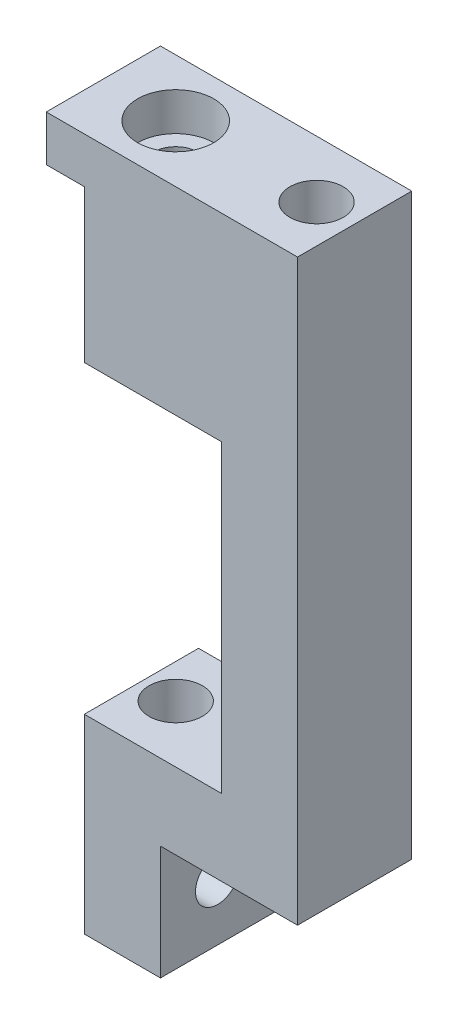
ISO-10303-21;
HEADER;
FILE_DESCRIPTION(('STEP AP214'),'2;1');
FILE_NAME('part.step','',(''),(''),'','','');
FILE_SCHEMA(('AUTOMOTIVE_DESIGN { 1 0 10303 214 1 1 1 1 }'));
ENDSEC;
DATA;
#1=APPLICATION_CONTEXT('core data for automotive mechanical design processes');
#2=APPLICATION_PROTOCOL_DEFINITION('international standard','automotive_design',2000,#1);
#3=PRODUCT_CONTEXT('',#1,'mechanical');
#4=PRODUCT('Part','Part','',(#3));
#5=PRODUCT_RELATED_PRODUCT_CATEGORY('part','',(#4));
#6=PRODUCT_DEFINITION_FORMATION('','',#4);
#7=PRODUCT_DEFINITION_CONTEXT('part definition',#1,'design');
#8=PRODUCT_DEFINITION('design','',#6,#7);
#9=PRODUCT_DEFINITION_SHAPE('','',#8);
#10=(LENGTH_UNIT() NAMED_UNIT(*) SI_UNIT(.MILLI.,.METRE.));
#11=(NAMED_UNIT(*) PLANE_ANGLE_UNIT() SI_UNIT($,.RADIAN.));
#12=(NAMED_UNIT(*) SI_UNIT($,.STERADIAN.) SOLID_ANGLE_UNIT());
#13=UNCERTAINTY_MEASURE_WITH_UNIT(LENGTH_MEASURE(1.E-05),#10,'distance_accuracy_value','');
#14=(GEOMETRIC_REPRESENTATION_CONTEXT(3) GLOBAL_UNCERTAINTY_ASSIGNED_CONTEXT((#13)) GLOBAL_UNIT_ASSIGNED_CONTEXT((#10,
#11,#12)) REPRESENTATION_CONTEXT('',''));
#15=CARTESIAN_POINT('',(0.,0.,0.));
#16=DIRECTION('',(0.,0.,1.));
#17=DIRECTION('',(1.,0.,0.));
#18=AXIS2_PLACEMENT_3D('',#15,#16,#17);
#19=CARTESIAN_POINT('',(10.,0.,0.));
#20=DIRECTION('',(-1.,0.,0.));
#21=DIRECTION('',(0.,0.,1.));
#22=AXIS2_PLACEMENT_3D('',#19,#20,#21);
#23=PLANE('',#22);
#24=DIRECTION('',(0.,-1.,0.));
#25=VECTOR('',#24,1.);
#26=CARTESIAN_POINT('',(10.,-70.,-7.5));
#27=LINE('',#26,#25);
#28=CARTESIAN_POINT('',(10.,-70.,-7.5));
#29=VERTEX_POINT('',#28);
#30=CARTESIAN_POINT('',(10.,-85.,-7.5));
#31=VERTEX_POINT('',#30);
#32=EDGE_CURVE('E70',#29,#31,#27,.T.);
#33=ORIENTED_EDGE('',*,*,#32,.F.);
#34=DIRECTION('',(0.,0.,-1.));
#35=VECTOR('',#34,1.);
#36=CARTESIAN_POINT('',(10.,-70.,-7.5));
#37=LINE('',#36,#35);
#38=CARTESIAN_POINT('',(10.,-70.,7.5));
#39=VERTEX_POINT('',#38);
#40=EDGE_CURVE('E222',#39,#29,#37,.T.);
#41=ORIENTED_EDGE('',*,*,#40,.F.);
#42=DIRECTION('',(0.,1.,0.));
#43=VECTOR('',#42,1.);
#44=CARTESIAN_POINT('',(10.,-70.,7.5));
#45=LINE('',#44,#43);
#46=CARTESIAN_POINT('',(10.,-85.,7.5));
#47=VERTEX_POINT('',#46);
#48=EDGE_CURVE('E221',#47,#39,#45,.T.);
#49=ORIENTED_EDGE('',*,*,#48,.F.);
#50=DIRECTION('',(0.,0.,1.));
#51=VECTOR('',#50,1.);
#52=CARTESIAN_POINT('',(10.,-85.,-7.5));
#53=LINE('',#52,#51);
#54=EDGE_CURVE('E220',#31,#47,#53,.T.);
#55=ORIENTED_EDGE('',*,*,#54,.F.);
#56=EDGE_LOOP('',(#33,#41,#49,#55));
#57=FACE_BOUND('',#56,.T.);
#58=CARTESIAN_POINT('',(10.,-77.5,0.));
#59=DIRECTION('',(1.,0.,0.));
#60=DIRECTION('',(0.,0.,-1.));
#61=AXIS2_PLACEMENT_3D('',#58,#59,#60);
#62=CIRCLE('',#61,2.89999999999999);
#63=CARTESIAN_POINT('',(10.,-77.5,-2.89999999999999));
#64=VERTEX_POINT('',#63);
#65=EDGE_CURVE('E207',#64,#64,#62,.T.);
#66=ORIENTED_EDGE('',*,*,#65,.F.);
#67=EDGE_LOOP('',(#66));
#68=FACE_BOUND('',#67,.T.);
#69=ADVANCED_FACE('F46',(#57,#68),#23,.F.);
#70=CARTESIAN_POINT('',(0.,-100.,7.5));
#71=DIRECTION('',(1.,0.,0.));
#72=DIRECTION('',(0.,0.,-1.));
#73=AXIS2_PLACEMENT_3D('',#70,#71,#72);
#74=PLANE('',#73);
#75=DIRECTION('',(0.,-1.,0.));
#76=VECTOR('',#75,1.);
#77=CARTESIAN_POINT('',(0.,-100.,-7.5));
#78=LINE('',#77,#76);
#79=CARTESIAN_POINT('',(0.,0.,-7.5));
#80=VERTEX_POINT('',#79);
#81=CARTESIAN_POINT('',(0.,-20.,-7.5));
#82=VERTEX_POINT('',#81);
#83=EDGE_CURVE('E301',#80,#82,#78,.T.);
#84=ORIENTED_EDGE('',*,*,#83,.T.);
#85=DIRECTION('',(0.,0.,1.));
#86=VECTOR('',#85,1.);
#87=CARTESIAN_POINT('',(0.,-20.,-7.501));
#88=LINE('',#87,#86);
#89=CARTESIAN_POINT('',(0.,-20.,7.5));
#90=VERTEX_POINT('',#89);
#91=EDGE_CURVE('E278',#82,#90,#88,.T.);
#92=ORIENTED_EDGE('',*,*,#91,.T.);
#93=DIRECTION('',(0.,-1.,0.));
#94=VECTOR('',#93,1.);
#95=CARTESIAN_POINT('',(0.,-100.,7.5));
#96=LINE('',#95,#94);
#97=CARTESIAN_POINT('',(0.,0.,7.5));
#98=VERTEX_POINT('',#97);
#99=EDGE_CURVE('E57',#98,#90,#96,.T.);
#100=ORIENTED_EDGE('',*,*,#99,.F.);
#101=DIRECTION('',(0.,0.,-1.));
#102=VECTOR('',#101,1.);
#103=CARTESIAN_POINT('',(0.,0.,7.5));
#104=LINE('',#103,#102);
#105=EDGE_CURVE('E12',#98,#80,#104,.T.);
#106=ORIENTED_EDGE('',*,*,#105,.T.);
#107=EDGE_LOOP('',(#84,#92,#100,#106));
#108=FACE_BOUND('',#107,.T.);
#109=ADVANCED_FACE('F327',(#108),#74,.F.);
#110=CARTESIAN_POINT('',(0.,-77.5,0.));
#111=DIRECTION('',(1.,0.,0.));
#112=DIRECTION('',(0.,0.,-1.));
#113=AXIS2_PLACEMENT_3D('',#110,#111,#112);
#114=CIRCLE('',#113,2.89999999999999);
#115=CARTESIAN_POINT('',(0.,-77.5,-2.89999999999999));
#116=VERTEX_POINT('',#115);
#117=EDGE_CURVE('E208',#116,#116,#114,.T.);
#118=ORIENTED_EDGE('',*,*,#117,.T.);
#119=EDGE_LOOP('',(#118));
#120=FACE_BOUND('',#119,.T.);
#121=CARTESIAN_POINT('',(0.,-60.,-7.5));
#122=VERTEX_POINT('',#121);
#123=CARTESIAN_POINT('',(0.,-85.,-7.5));
#124=VERTEX_POINT('',#123);
#125=EDGE_CURVE('E298',#122,#124,#78,.T.);
#126=ORIENTED_EDGE('',*,*,#125,.T.);
#127=DIRECTION('',(0.,0.,1.));
#128=VECTOR('',#127,1.);
#129=CARTESIAN_POINT('',(0.,-85.,-7.5));
#130=LINE('',#129,#128);
#131=CARTESIAN_POINT('',(0.,-85.,7.5));
#132=VERTEX_POINT('',#131);
#133=EDGE_CURVE('E211',#124,#132,#130,.T.);
#134=ORIENTED_EDGE('',*,*,#133,.T.);
#135=CARTESIAN_POINT('',(0.,-60.,7.5));
#136=VERTEX_POINT('',#135);
#137=EDGE_CURVE('E297',#136,#132,#96,.T.);
#138=ORIENTED_EDGE('',*,*,#137,.F.);
#139=DIRECTION('',(0.,0.,1.));
#140=VECTOR('',#139,1.);
#141=CARTESIAN_POINT('',(0.,-60.,-7.501));
#142=LINE('',#141,#140);
#143=EDGE_CURVE('E276',#122,#136,#142,.T.);
#144=ORIENTED_EDGE('',*,*,#143,.F.);
#145=EDGE_LOOP('',(#126,#134,#138,#144));
#146=FACE_BOUND('',#145,.T.);
#147=ADVANCED_FACE('F334',(#120,#146),#74,.F.);
#148=CARTESIAN_POINT('',(0.,0.,7.5));
#149=DIRECTION('',(0.,0.,-1.));
#150=DIRECTION('',(-1.,0.,0.));
#151=AXIS2_PLACEMENT_3D('',#148,#149,#150);
#152=PLANE('',#151);
#153=DIRECTION('',(-1.,0.,0.));
#154=VECTOR('',#153,1.);
#155=CARTESIAN_POINT('',(0.,-70.,7.5));
#156=LINE('',#155,#154);
#157=CARTESIAN_POINT('',(28.,-70.,7.5));
#158=VERTEX_POINT('',#157);
#159=EDGE_CURVE('E252',#158,#39,#156,.T.);
#160=ORIENTED_EDGE('',*,*,#159,.F.);
#161=DIRECTION('',(0.,-1.,0.));
#162=VECTOR('',#161,1.);
#163=CARTESIAN_POINT('',(28.,0.,7.5));
#164=LINE('',#163,#162);
#165=CARTESIAN_POINT('',(28.,6.,7.5));
#166=VERTEX_POINT('',#165);
#167=EDGE_CURVE('E76',#166,#158,#164,.T.);
#168=ORIENTED_EDGE('',*,*,#167,.F.);
#169=DIRECTION('',(1.,0.,0.));
#170=VECTOR('',#169,1.);
#171=CARTESIAN_POINT('',(-5.,6.,7.50000000000001));
#172=LINE('',#171,#170);
#173=CARTESIAN_POINT('',(-5.,6.,7.50000000000001));
#174=VERTEX_POINT('',#173);
#175=EDGE_CURVE('E161',#174,#166,#172,.T.);
#176=ORIENTED_EDGE('',*,*,#175,.F.);
#177=DIRECTION('',(0.,-1.,0.));
#178=VECTOR('',#177,1.);
#179=CARTESIAN_POINT('',(-5.,6.,7.50000000000001));
#180=LINE('',#179,#178);
#181=CARTESIAN_POINT('',(-5.,0.,7.50000000000001));
#182=VERTEX_POINT('',#181);
#183=EDGE_CURVE('E169',#174,#182,#180,.T.);
#184=ORIENTED_EDGE('',*,*,#183,.T.);
#185=DIRECTION('',(1.,0.,0.));
#186=VECTOR('',#185,1.);
#187=CARTESIAN_POINT('',(-5.,0.,7.50000000000001));
#188=LINE('',#187,#186);
#189=EDGE_CURVE('E381',#182,#98,#188,.T.);
#190=ORIENTED_EDGE('',*,*,#189,.T.);
#191=ORIENTED_EDGE('',*,*,#99,.T.);
#192=DIRECTION('',(-1.,0.,0.));
#193=VECTOR('',#192,1.);
#194=CARTESIAN_POINT('',(0.,-20.,7.5));
#195=LINE('',#194,#193);
#196=CARTESIAN_POINT('',(18.,-20.,7.5));
#197=VERTEX_POINT('',#196);
#198=EDGE_CURVE('E277',#197,#90,#195,.T.);
#199=ORIENTED_EDGE('',*,*,#198,.F.);
#200=DIRECTION('',(0.,1.,0.));
#201=VECTOR('',#200,1.);
#202=CARTESIAN_POINT('',(18.,-20.,7.5));
#203=LINE('',#202,#201);
#204=CARTESIAN_POINT('',(18.,-60.,7.5));
#205=VERTEX_POINT('',#204);
#206=EDGE_CURVE('E275',#205,#197,#203,.T.);
#207=ORIENTED_EDGE('',*,*,#206,.F.);
#208=DIRECTION('',(1.,0.,0.));
#209=VECTOR('',#208,1.);
#210=CARTESIAN_POINT('',(0.,-60.,7.5));
#211=LINE('',#210,#209);
#212=EDGE_CURVE('E268',#136,#205,#211,.T.);
#213=ORIENTED_EDGE('',*,*,#212,.F.);
#214=ORIENTED_EDGE('',*,*,#137,.T.);
#215=DIRECTION('',(-1.,0.,0.));
#216=VECTOR('',#215,1.);
#217=CARTESIAN_POINT('',(10.,-85.,7.5));
#218=LINE('',#217,#216);
#219=EDGE_CURVE('E233',#47,#132,#218,.T.);
#220=ORIENTED_EDGE('',*,*,#219,.F.);
#221=ORIENTED_EDGE('',*,*,#48,.T.);
#222=EDGE_LOOP('',(#160,#168,#176,#184,#190,#191,#199,#207,#213,#214,#220,#221));
#223=FACE_BOUND('',#222,.T.);
#224=ADVANCED_FACE('F168',(#223),#152,.F.);
#225=CARTESIAN_POINT('',(0.,0.,-7.5));
#226=DIRECTION('',(0.,0.,-1.));
#227=DIRECTION('',(-1.,0.,0.));
#228=AXIS2_PLACEMENT_3D('',#225,#226,#227);
#229=PLANE('',#228);
#230=DIRECTION('',(0.,-1.,0.));
#231=VECTOR('',#230,1.);
#232=CARTESIAN_POINT('',(28.,0.,-7.5));
#233=LINE('',#232,#231);
#234=CARTESIAN_POINT('',(28.,6.,-7.5));
#235=VERTEX_POINT('',#234);
#236=CARTESIAN_POINT('',(28.,-70.,-7.5));
#237=VERTEX_POINT('',#236);
#238=EDGE_CURVE('E243',#235,#237,#233,.T.);
#239=ORIENTED_EDGE('',*,*,#238,.T.);
#240=DIRECTION('',(-1.,0.,0.));
#241=VECTOR('',#240,1.);
#242=CARTESIAN_POINT('',(0.,-70.,-7.5));
#243=LINE('',#242,#241);
#244=EDGE_CURVE('E250',#237,#29,#243,.T.);
#245=ORIENTED_EDGE('',*,*,#244,.T.);
#246=ORIENTED_EDGE('',*,*,#32,.T.);
#247=DIRECTION('',(-1.,0.,0.));
#248=VECTOR('',#247,1.);
#249=CARTESIAN_POINT('',(10.,-85.,-7.5));
#250=LINE('',#249,#248);
#251=EDGE_CURVE('E227',#31,#124,#250,.T.);
#252=ORIENTED_EDGE('',*,*,#251,.T.);
#253=ORIENTED_EDGE('',*,*,#125,.F.);
#254=DIRECTION('',(1.,0.,0.));
#255=VECTOR('',#254,1.);
#256=CARTESIAN_POINT('',(0.,-60.,-7.5));
#257=LINE('',#256,#255);
#258=CARTESIAN_POINT('',(18.,-60.,-7.5));
#259=VERTEX_POINT('',#258);
#260=EDGE_CURVE('E282',#122,#259,#257,.T.);
#261=ORIENTED_EDGE('',*,*,#260,.T.);
#262=DIRECTION('',(0.,1.,0.));
#263=VECTOR('',#262,1.);
#264=CARTESIAN_POINT('',(18.,-20.,-7.5));
#265=LINE('',#264,#263);
#266=CARTESIAN_POINT('',(18.,-20.,-7.5));
#267=VERTEX_POINT('',#266);
#268=EDGE_CURVE('E258',#259,#267,#265,.T.);
#269=ORIENTED_EDGE('',*,*,#268,.T.);
#270=DIRECTION('',(-1.,0.,0.));
#271=VECTOR('',#270,1.);
#272=CARTESIAN_POINT('',(0.,-20.,-7.5));
#273=LINE('',#272,#271);
#274=EDGE_CURVE('E262',#267,#82,#273,.T.);
#275=ORIENTED_EDGE('',*,*,#274,.T.);
#276=ORIENTED_EDGE('',*,*,#83,.F.);
#277=DIRECTION('',(-1.,0.,0.));
#278=VECTOR('',#277,1.);
#279=CARTESIAN_POINT('',(28.,0.,-7.5));
#280=LINE('',#279,#278);
#281=CARTESIAN_POINT('',(-5.,0.,-7.5));
#282=VERTEX_POINT('',#281);
#283=EDGE_CURVE('E187',#80,#282,#280,.T.);
#284=ORIENTED_EDGE('',*,*,#283,.T.);
#285=DIRECTION('',(0.,-1.,0.));
#286=VECTOR('',#285,1.);
#287=CARTESIAN_POINT('',(-5.,6.,-7.5));
#288=LINE('',#287,#286);
#289=CARTESIAN_POINT('',(-5.,6.,-7.5));
#290=VERTEX_POINT('',#289);
#291=EDGE_CURVE('E194',#290,#282,#288,.T.);
#292=ORIENTED_EDGE('',*,*,#291,.F.);
#293=DIRECTION('',(-1.,0.,0.));
#294=VECTOR('',#293,1.);
#295=CARTESIAN_POINT('',(28.,6.,-7.5));
#296=LINE('',#295,#294);
#297=EDGE_CURVE('E181',#235,#290,#296,.T.);
#298=ORIENTED_EDGE('',*,*,#297,.F.);
#299=EDGE_LOOP('',(#239,#245,#246,#252,#253,#261,#269,#275,#276,#284,#292,#298));
#300=FACE_BOUND('',#299,.T.);
#301=ADVANCED_FACE('F358',(#300),#229,.T.);
#302=CARTESIAN_POINT('',(0.,-20.,-7.501));
#303=DIRECTION('',(0.,1.,0.));
#304=DIRECTION('',(0.,0.,1.));
#305=AXIS2_PLACEMENT_3D('',#302,#303,#304);
#306=PLANE('',#305);
#307=CARTESIAN_POINT('',(4.5,-20.,0.));
#308=DIRECTION('',(0.,1.,0.));
#309=DIRECTION('',(0.,0.,1.));
#310=AXIS2_PLACEMENT_3D('',#307,#308,#309);
#311=CIRCLE('',#310,2.89999999999998);
#312=CARTESIAN_POINT('',(4.5,-20.,2.89999999999998));
#313=VERTEX_POINT('',#312);
#314=EDGE_CURVE('E257',#313,#313,#311,.T.);
#315=ORIENTED_EDGE('',*,*,#314,.T.);
#316=EDGE_LOOP('',(#315));
#317=FACE_BOUND('',#316,.T.);
#318=DIRECTION('',(0.,0.,1.));
#319=VECTOR('',#318,1.);
#320=CARTESIAN_POINT('',(18.,-20.,-7.501));
#321=LINE('',#320,#319);
#322=EDGE_CURVE('E284',#267,#197,#321,.T.);
#323=ORIENTED_EDGE('',*,*,#322,.T.);
#324=ORIENTED_EDGE('',*,*,#198,.T.);
#325=ORIENTED_EDGE('',*,*,#91,.F.);
#326=ORIENTED_EDGE('',*,*,#274,.F.);
#327=EDGE_LOOP('',(#323,#324,#325,#326));
#328=FACE_BOUND('',#327,.T.);
#329=ADVANCED_FACE('F353',(#317,#328),#306,.F.);
#330=CARTESIAN_POINT('',(18.,-20.,-7.501));
#331=DIRECTION('',(1.,0.,0.));
#332=DIRECTION('',(0.,1.,0.));
#333=AXIS2_PLACEMENT_3D('',#330,#331,#332);
#334=PLANE('',#333);
#335=DIRECTION('',(0.,0.,1.));
#336=VECTOR('',#335,1.);
#337=CARTESIAN_POINT('',(18.,-60.,-7.501));
#338=LINE('',#337,#336);
#339=EDGE_CURVE('E288',#259,#205,#338,.T.);
#340=ORIENTED_EDGE('',*,*,#339,.T.);
#341=ORIENTED_EDGE('',*,*,#206,.T.);
#342=ORIENTED_EDGE('',*,*,#322,.F.);
#343=ORIENTED_EDGE('',*,*,#268,.F.);
#344=EDGE_LOOP('',(#340,#341,#342,#343));
#345=FACE_BOUND('',#344,.T.);
#346=ADVANCED_FACE('F328',(#345),#334,.F.);
#347=CARTESIAN_POINT('',(0.,-60.,-7.501));
#348=DIRECTION('',(0.,-1.,0.));
#349=DIRECTION('',(1.,0.,0.));
#350=AXIS2_PLACEMENT_3D('',#347,#348,#349);
#351=PLANE('',#350);
#352=CARTESIAN_POINT('',(4.5,-60.,0.));
#353=DIRECTION('',(0.,-1.,0.));
#354=DIRECTION('',(1.,0.,0.));
#355=AXIS2_PLACEMENT_3D('',#352,#353,#354);
#356=CIRCLE('',#355,3.49999999999998);
#357=CARTESIAN_POINT('',(7.99999999999998,-60.,0.));
#358=VERTEX_POINT('',#357);
#359=EDGE_CURVE('E49',#358,#358,#356,.T.);
#360=ORIENTED_EDGE('',*,*,#359,.T.);
#361=EDGE_LOOP('',(#360));
#362=FACE_BOUND('',#361,.T.);
#363=ORIENTED_EDGE('',*,*,#143,.T.);
#364=ORIENTED_EDGE('',*,*,#212,.T.);
#365=ORIENTED_EDGE('',*,*,#339,.F.);
#366=ORIENTED_EDGE('',*,*,#260,.F.);
#367=EDGE_LOOP('',(#363,#364,#365,#366));
#368=FACE_BOUND('',#367,.T.);
#369=ADVANCED_FACE('F315',(#362,#368),#351,.F.);
#370=CARTESIAN_POINT('',(4.5,0.,0.));
#371=DIRECTION('',(0.,1.,0.));
#372=DIRECTION('',(0.,0.,1.));
#373=AXIS2_PLACEMENT_3D('',#370,#371,#372);
#374=CYLINDRICAL_SURFACE('',#373,3.49999999999998);
#375=CARTESIAN_POINT('',(4.5,-70.,0.));
#376=DIRECTION('',(0.,1.,0.));
#377=DIRECTION('',(0.,0.,1.));
#378=AXIS2_PLACEMENT_3D('',#375,#376,#377);
#379=CIRCLE('',#378,3.49999999999998);
#380=CARTESIAN_POINT('',(4.5,-70.,3.49999999999998));
#381=VERTEX_POINT('',#380);
#382=EDGE_CURVE('E253',#381,#381,#379,.T.);
#383=ORIENTED_EDGE('',*,*,#382,.F.);
#384=EDGE_LOOP('',(#383));
#385=FACE_BOUND('',#384,.T.);
#386=ORIENTED_EDGE('',*,*,#359,.F.);
#387=EDGE_LOOP('',(#386));
#388=FACE_BOUND('',#387,.T.);
#389=ADVANCED_FACE('F48',(#385,#388),#374,.F.);
#390=CARTESIAN_POINT('',(4.5,0.,0.));
#391=DIRECTION('',(0.,1.,0.));
#392=DIRECTION('',(0.,0.,1.));
#393=AXIS2_PLACEMENT_3D('',#390,#391,#392);
#394=CYLINDRICAL_SURFACE('',#393,2.89999999999998);
#395=ORIENTED_EDGE('',*,*,#314,.F.);
#396=EDGE_LOOP('',(#395));
#397=FACE_BOUND('',#396,.T.);
#398=CARTESIAN_POINT('',(4.5,1.,0.));
#399=DIRECTION('',(0.,1.,0.));
#400=DIRECTION('',(0.,0.,1.));
#401=AXIS2_PLACEMENT_3D('',#398,#399,#400);
#402=CIRCLE('',#401,2.89999999999999);
#403=CARTESIAN_POINT('',(4.5,1.,2.89999999999999));
#404=VERTEX_POINT('',#403);
#405=EDGE_CURVE('E196',#404,#404,#402,.T.);
#406=ORIENTED_EDGE('',*,*,#405,.T.);
#407=EDGE_LOOP('',(#406));
#408=FACE_BOUND('',#407,.T.);
#409=ADVANCED_FACE('F317',(#397,#408),#394,.F.);
#410=CARTESIAN_POINT('',(0.,-70.,-7.501));
#411=DIRECTION('',(0.,1.,0.));
#412=DIRECTION('',(0.,0.,1.));
#413=AXIS2_PLACEMENT_3D('',#410,#411,#412);
#414=PLANE('',#413);
#415=ORIENTED_EDGE('',*,*,#159,.T.);
#416=ORIENTED_EDGE('',*,*,#40,.T.);
#417=ORIENTED_EDGE('',*,*,#244,.F.);
#418=DIRECTION('',(0.,0.,1.));
#419=VECTOR('',#418,1.);
#420=CARTESIAN_POINT('',(28.,-70.,-7.501));
#421=LINE('',#420,#419);
#422=EDGE_CURVE('E239',#237,#158,#421,.T.);
#423=ORIENTED_EDGE('',*,*,#422,.T.);
#424=EDGE_LOOP('',(#415,#416,#417,#423));
#425=FACE_BOUND('',#424,.T.);
#426=ADVANCED_FACE('F325',(#425),#414,.F.);
#427=CARTESIAN_POINT('',(28.,0.,-7.501));
#428=DIRECTION('',(-1.,0.,0.));
#429=DIRECTION('',(0.,-1.,0.));
#430=AXIS2_PLACEMENT_3D('',#427,#428,#429);
#431=PLANE('',#430);
#432=ORIENTED_EDGE('',*,*,#238,.F.);
#433=DIRECTION('',(0.,0.,-1.));
#434=VECTOR('',#433,1.);
#435=CARTESIAN_POINT('',(28.,6.,7.5));
#436=LINE('',#435,#434);
#437=EDGE_CURVE('E172',#166,#235,#436,.T.);
#438=ORIENTED_EDGE('',*,*,#437,.F.);
#439=ORIENTED_EDGE('',*,*,#167,.T.);
#440=ORIENTED_EDGE('',*,*,#422,.F.);
#441=EDGE_LOOP('',(#432,#438,#439,#440));
#442=FACE_BOUND('',#441,.T.);
#443=ADVANCED_FACE('F350',(#442),#431,.F.);
#444=CARTESIAN_POINT('',(10.,-85.,-7.5));
#445=DIRECTION('',(0.,-1.,0.));
#446=DIRECTION('',(0.,0.,-1.));
#447=AXIS2_PLACEMENT_3D('',#444,#445,#446);
#448=PLANE('',#447);
#449=ORIENTED_EDGE('',*,*,#133,.F.);
#450=ORIENTED_EDGE('',*,*,#251,.F.);
#451=ORIENTED_EDGE('',*,*,#54,.T.);
#452=ORIENTED_EDGE('',*,*,#219,.T.);
#453=EDGE_LOOP('',(#449,#450,#451,#452));
#454=FACE_BOUND('',#453,.T.);
#455=ADVANCED_FACE('F341',(#454),#448,.T.);
#456=CARTESIAN_POINT('',(10.,-70.,-7.5));
#457=DIRECTION('',(0.,1.,0.));
#458=DIRECTION('',(0.,0.,1.));
#459=AXIS2_PLACEMENT_3D('',#456,#457,#458);
#460=PLANE('',#459);
#461=ORIENTED_EDGE('',*,*,#382,.T.);
#462=EDGE_LOOP('',(#461));
#463=FACE_BOUND('',#462,.T.);
#464=ADVANCED_FACE('F345',(#463),#460,.T.);
#465=CARTESIAN_POINT('',(10.,-77.5,0.));
#466=DIRECTION('',(1.,0.,0.));
#467=DIRECTION('',(0.,0.,-1.));
#468=AXIS2_PLACEMENT_3D('',#465,#466,#467);
#469=CYLINDRICAL_SURFACE('',#468,2.89999999999999);
#470=ORIENTED_EDGE('',*,*,#117,.F.);
#471=EDGE_LOOP('',(#470));
#472=FACE_BOUND('',#471,.T.);
#473=ORIENTED_EDGE('',*,*,#65,.T.);
#474=EDGE_LOOP('',(#473));
#475=FACE_BOUND('',#474,.T.);
#476=ADVANCED_FACE('F338',(#472,#475),#469,.F.);
#477=CARTESIAN_POINT('',(4.5,1.,0.));
#478=DIRECTION('',(0.,1.,0.));
#479=DIRECTION('',(0.,0.,1.));
#480=AXIS2_PLACEMENT_3D('',#477,#478,#479);
#481=PLANE('',#480);
#482=CARTESIAN_POINT('',(4.5,1.,0.));
#483=DIRECTION('',(0.,1.,0.));
#484=DIRECTION('',(0.,0.,1.));
#485=AXIS2_PLACEMENT_3D('',#482,#483,#484);
#486=CIRCLE('',#485,5.);
#487=CARTESIAN_POINT('',(4.5,1.,5.));
#488=VERTEX_POINT('',#487);
#489=EDGE_CURVE('E195',#488,#488,#486,.F.);
#490=ORIENTED_EDGE('',*,*,#489,.F.);
#491=EDGE_LOOP('',(#490));
#492=FACE_BOUND('',#491,.T.);
#493=ORIENTED_EDGE('',*,*,#405,.F.);
#494=EDGE_LOOP('',(#493));
#495=FACE_BOUND('',#494,.T.);
#496=ADVANCED_FACE('F399',(#492,#495),#481,.T.);
#497=CARTESIAN_POINT('',(4.5,0.,0.));
#498=DIRECTION('',(0.,1.,0.));
#499=DIRECTION('',(0.,0.,1.));
#500=AXIS2_PLACEMENT_3D('',#497,#498,#499);
#501=PLANE('',#500);
#502=ORIENTED_EDGE('',*,*,#283,.F.);
#503=ORIENTED_EDGE('',*,*,#105,.F.);
#504=ORIENTED_EDGE('',*,*,#189,.F.);
#505=DIRECTION('',(0.,0.,1.));
#506=VECTOR('',#505,1.);
#507=CARTESIAN_POINT('',(-5.,0.,-7.5));
#508=LINE('',#507,#506);
#509=EDGE_CURVE('E188',#282,#182,#508,.T.);
#510=ORIENTED_EDGE('',*,*,#509,.F.);
#511=EDGE_LOOP('',(#502,#503,#504,#510));
#512=FACE_BOUND('',#511,.T.);
#513=ADVANCED_FACE('F395',(#512),#501,.F.);
#514=CARTESIAN_POINT('',(0.,6.,0.));
#515=DIRECTION('',(0.,1.,0.));
#516=DIRECTION('',(0.,0.,1.));
#517=AXIS2_PLACEMENT_3D('',#514,#515,#516);
#518=PLANE('',#517);
#519=CARTESIAN_POINT('',(23.,6.,0.));
#520=DIRECTION('',(0.,1.,0.));
#521=DIRECTION('',(0.,0.,1.));
#522=AXIS2_PLACEMENT_3D('',#519,#520,#521);
#523=CIRCLE('',#522,3.49999999999999);
#524=CARTESIAN_POINT('',(23.,6.,3.49999999999999));
#525=VERTEX_POINT('',#524);
#526=EDGE_CURVE('E429',#525,#525,#523,.T.);
#527=ORIENTED_EDGE('',*,*,#526,.F.);
#528=EDGE_LOOP('',(#527));
#529=FACE_BOUND('',#528,.T.);
#530=DIRECTION('',(0.,0.,1.));
#531=VECTOR('',#530,1.);
#532=CARTESIAN_POINT('',(-5.,6.,-7.5));
#533=LINE('',#532,#531);
#534=EDGE_CURVE('E174',#290,#174,#533,.T.);
#535=ORIENTED_EDGE('',*,*,#534,.T.);
#536=ORIENTED_EDGE('',*,*,#175,.T.);
#537=ORIENTED_EDGE('',*,*,#437,.T.);
#538=ORIENTED_EDGE('',*,*,#297,.T.);
#539=EDGE_LOOP('',(#535,#536,#537,#538));
#540=FACE_BOUND('',#539,.T.);
#541=CARTESIAN_POINT('',(4.5,6.,0.));
#542=DIRECTION('',(0.,1.,0.));
#543=DIRECTION('',(0.,0.,1.));
#544=AXIS2_PLACEMENT_3D('',#541,#542,#543);
#545=CIRCLE('',#544,5.);
#546=CARTESIAN_POINT('',(4.5,6.,5.));
#547=VERTEX_POINT('',#546);
#548=EDGE_CURVE('E383',#547,#547,#545,.T.);
#549=ORIENTED_EDGE('',*,*,#548,.F.);
#550=EDGE_LOOP('',(#549));
#551=FACE_BOUND('',#550,.T.);
#552=ADVANCED_FACE('F178',(#529,#540,#551),#518,.T.);
#553=CARTESIAN_POINT('',(-5.,6.,-7.5));
#554=DIRECTION('',(1.,0.,0.));
#555=DIRECTION('',(0.,0.,-1.));
#556=AXIS2_PLACEMENT_3D('',#553,#554,#555);
#557=PLANE('',#556);
#558=ORIENTED_EDGE('',*,*,#509,.T.);
#559=ORIENTED_EDGE('',*,*,#183,.F.);
#560=ORIENTED_EDGE('',*,*,#534,.F.);
#561=ORIENTED_EDGE('',*,*,#291,.T.);
#562=EDGE_LOOP('',(#558,#559,#560,#561));
#563=FACE_BOUND('',#562,.T.);
#564=ADVANCED_FACE('F189',(#563),#557,.F.);
#565=CARTESIAN_POINT('',(4.5,6.,0.));
#566=DIRECTION('',(0.,-1.,0.));
#567=DIRECTION('',(0.,0.,-1.));
#568=AXIS2_PLACEMENT_3D('',#565,#566,#567);
#569=CYLINDRICAL_SURFACE('',#568,5.);
#570=ORIENTED_EDGE('',*,*,#489,.T.);
#571=EDGE_LOOP('',(#570));
#572=FACE_BOUND('',#571,.T.);
#573=ORIENTED_EDGE('',*,*,#548,.T.);
#574=EDGE_LOOP('',(#573));
#575=FACE_BOUND('',#574,.T.);
#576=ADVANCED_FACE('F413',(#572,#575),#569,.F.);
#577=CARTESIAN_POINT('',(23.,-24.,0.));
#578=DIRECTION('',(0.,-1.,0.));
#579=DIRECTION('',(0.,0.,-1.));
#580=AXIS2_PLACEMENT_3D('',#577,#578,#579);
#581=PLANE('',#580);
#582=CARTESIAN_POINT('',(23.,-24.,0.));
#583=DIRECTION('',(0.,1.,0.));
#584=DIRECTION('',(0.,0.,1.));
#585=AXIS2_PLACEMENT_3D('',#582,#583,#584);
#586=CIRCLE('',#585,3.49999999999999);
#587=CARTESIAN_POINT('',(23.,-24.,3.49999999999999));
#588=VERTEX_POINT('',#587);
#589=EDGE_CURVE('E428',#588,#588,#586,.T.);
#590=ORIENTED_EDGE('',*,*,#589,.T.);
#591=EDGE_LOOP('',(#590));
#592=FACE_BOUND('',#591,.T.);
#593=ADVANCED_FACE('F412',(#592),#581,.F.);
#594=CARTESIAN_POINT('',(23.,6.,0.));
#595=DIRECTION('',(0.,1.,0.));
#596=DIRECTION('',(0.,0.,1.));
#597=AXIS2_PLACEMENT_3D('',#594,#595,#596);
#598=CYLINDRICAL_SURFACE('',#597,3.49999999999999);
#599=ORIENTED_EDGE('',*,*,#589,.F.);
#600=EDGE_LOOP('',(#599));
#601=FACE_BOUND('',#600,.T.);
#602=ORIENTED_EDGE('',*,*,#526,.T.);
#603=EDGE_LOOP('',(#602));
#604=FACE_BOUND('',#603,.T.);
#605=ADVANCED_FACE('F418',(#601,#604),#598,.F.);
#606=CLOSED_SHELL('',(#69,#109,#147,#224,#301,#329,#346,#369,#389,#409,#426,#443,#455,#464,#476,
#496,#513,#552,#564,#576,#593,#605));
#607=MANIFOLD_SOLID_BREP('B2',#606);
#608=ADVANCED_BREP_SHAPE_REPRESENTATION('',(#18,#607),#14);
#609=SHAPE_DEFINITION_REPRESENTATION(#9,#608);
ENDSEC;
END-ISO-10303-21;
